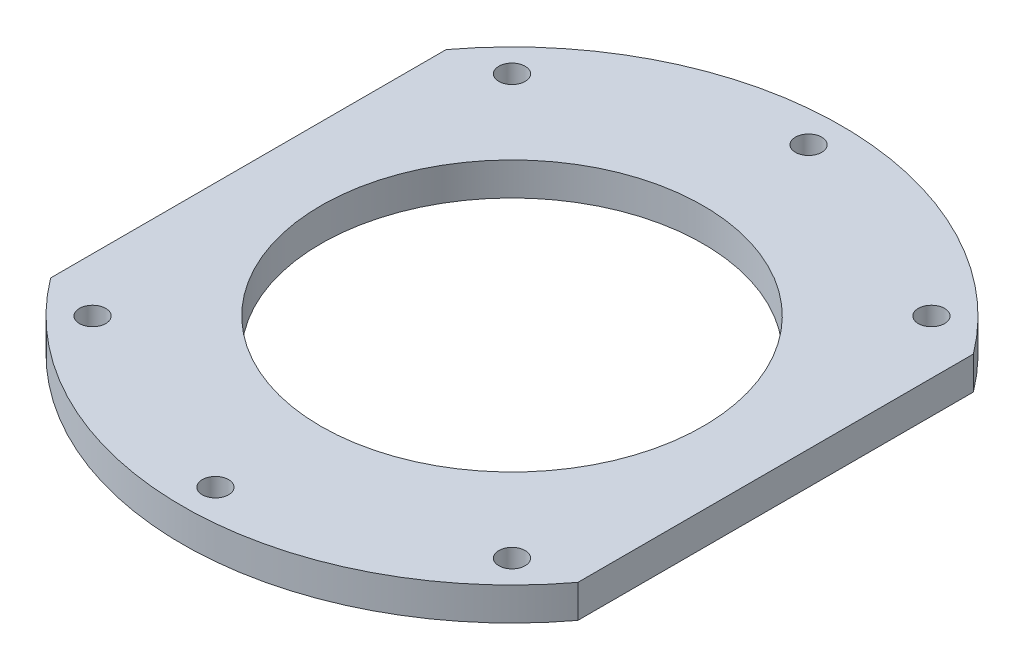
ISO-10303-21;
HEADER;
FILE_DESCRIPTION(('STEP AP214'),'2;1');
FILE_NAME('part.step','',(''),(''),'','','');
FILE_SCHEMA(('AUTOMOTIVE_DESIGN { 1 0 10303 214 1 1 1 1 }'));
ENDSEC;
DATA;
#1=APPLICATION_CONTEXT('core data for automotive mechanical design processes');
#2=APPLICATION_PROTOCOL_DEFINITION('international standard','automotive_design',2000,#1);
#3=PRODUCT_CONTEXT('',#1,'mechanical');
#4=PRODUCT('Part','Part','',(#3));
#5=PRODUCT_RELATED_PRODUCT_CATEGORY('part','',(#4));
#6=PRODUCT_DEFINITION_FORMATION('','',#4);
#7=PRODUCT_DEFINITION_CONTEXT('part definition',#1,'design');
#8=PRODUCT_DEFINITION('design','',#6,#7);
#9=PRODUCT_DEFINITION_SHAPE('','',#8);
#10=(LENGTH_UNIT() NAMED_UNIT(*) SI_UNIT(.MILLI.,.METRE.));
#11=(NAMED_UNIT(*) PLANE_ANGLE_UNIT() SI_UNIT($,.RADIAN.));
#12=(NAMED_UNIT(*) SI_UNIT($,.STERADIAN.) SOLID_ANGLE_UNIT());
#13=UNCERTAINTY_MEASURE_WITH_UNIT(LENGTH_MEASURE(1.E-05),#10,'distance_accuracy_value','');
#14=(GEOMETRIC_REPRESENTATION_CONTEXT(3) GLOBAL_UNCERTAINTY_ASSIGNED_CONTEXT((#13)) GLOBAL_UNIT_ASSIGNED_CONTEXT((#10,
#11,#12)) REPRESENTATION_CONTEXT('',''));
#15=CARTESIAN_POINT('',(0.,0.,0.));
#16=DIRECTION('',(0.,0.,1.));
#17=DIRECTION('',(1.,0.,0.));
#18=AXIS2_PLACEMENT_3D('',#15,#16,#17);
#19=CARTESIAN_POINT('',(0.,5.,0.));
#20=DIRECTION('',(0.,1.,0.));
#21=DIRECTION('',(0.,0.,1.));
#22=AXIS2_PLACEMENT_3D('',#19,#20,#21);
#23=PLANE('',#22);
#24=CARTESIAN_POINT('',(0.,5.,-45.));
#25=DIRECTION('',(0.,1.,0.));
#26=DIRECTION('',(0.,0.,1.));
#27=AXIS2_PLACEMENT_3D('',#24,#25,#26);
#28=CIRCLE('',#27,2.);
#29=CARTESIAN_POINT('',(0.,5.,-43.));
#30=VERTEX_POINT('',#29);
#31=EDGE_CURVE('E269',#30,#30,#28,.T.);
#32=ORIENTED_EDGE('',*,*,#31,.F.);
#33=EDGE_LOOP('',(#32));
#34=FACE_BOUND('',#33,.T.);
#35=CARTESIAN_POINT('',(0.,5.,45.));
#36=DIRECTION('',(0.,1.,0.));
#37=DIRECTION('',(0.,0.,1.));
#38=AXIS2_PLACEMENT_3D('',#35,#36,#37);
#39=CIRCLE('',#38,2.);
#40=CARTESIAN_POINT('',(0.,5.,47.));
#41=VERTEX_POINT('',#40);
#42=EDGE_CURVE('E287',#41,#41,#39,.T.);
#43=ORIENTED_EDGE('',*,*,#42,.F.);
#44=EDGE_LOOP('',(#43));
#45=FACE_BOUND('',#44,.T.);
#46=CARTESIAN_POINT('',(0.,5.,0.));
#47=DIRECTION('',(0.,1.,0.));
#48=DIRECTION('',(0.,0.,1.));
#49=AXIS2_PLACEMENT_3D('',#46,#47,#48);
#50=CIRCLE('',#49,29.);
#51=CARTESIAN_POINT('',(0.,5.,29.));
#52=VERTEX_POINT('',#51);
#53=EDGE_CURVE('E126',#52,#52,#50,.T.);
#54=ORIENTED_EDGE('',*,*,#53,.F.);
#55=EDGE_LOOP('',(#54));
#56=FACE_BOUND('',#55,.T.);
#57=CARTESIAN_POINT('',(31.8198051533946,5.,31.8198051533946));
#58=DIRECTION('',(0.,1.,0.));
#59=DIRECTION('',(0.,0.,1.));
#60=AXIS2_PLACEMENT_3D('',#57,#58,#59);
#61=CIRCLE('',#60,2.);
#62=CARTESIAN_POINT('',(31.8198051533946,5.,33.8198051533946));
#63=VERTEX_POINT('',#62);
#64=EDGE_CURVE('E293',#63,#63,#61,.T.);
#65=ORIENTED_EDGE('',*,*,#64,.F.);
#66=EDGE_LOOP('',(#65));
#67=FACE_BOUND('',#66,.T.);
#68=CARTESIAN_POINT('',(-31.8198051533946,5.,31.8198051533946));
#69=DIRECTION('',(0.,1.,0.));
#70=DIRECTION('',(0.,0.,1.));
#71=AXIS2_PLACEMENT_3D('',#68,#69,#70);
#72=CIRCLE('',#71,2.);
#73=CARTESIAN_POINT('',(-31.8198051533946,5.,33.8198051533946));
#74=VERTEX_POINT('',#73);
#75=EDGE_CURVE('E281',#74,#74,#72,.T.);
#76=ORIENTED_EDGE('',*,*,#75,.F.);
#77=EDGE_LOOP('',(#76));
#78=FACE_BOUND('',#77,.T.);
#79=CARTESIAN_POINT('',(-31.8198051533946,5.,-31.8198051533946));
#80=DIRECTION('',(0.,1.,0.));
#81=DIRECTION('',(0.,0.,1.));
#82=AXIS2_PLACEMENT_3D('',#79,#80,#81);
#83=CIRCLE('',#82,2.00000000000001);
#84=CARTESIAN_POINT('',(-31.8198051533946,5.,-29.8198051533946));
#85=VERTEX_POINT('',#84);
#86=EDGE_CURVE('E275',#85,#85,#83,.T.);
#87=ORIENTED_EDGE('',*,*,#86,.F.);
#88=EDGE_LOOP('',(#87));
#89=FACE_BOUND('',#88,.T.);
#90=CARTESIAN_POINT('',(31.8198051533946,5.,-31.8198051533947));
#91=DIRECTION('',(0.,1.,0.));
#92=DIRECTION('',(0.,0.,1.));
#93=AXIS2_PLACEMENT_3D('',#90,#91,#92);
#94=CIRCLE('',#93,2.00000000000001);
#95=CARTESIAN_POINT('',(31.8198051533946,5.,-29.8198051533946));
#96=VERTEX_POINT('',#95);
#97=EDGE_CURVE('E259',#96,#96,#94,.T.);
#98=ORIENTED_EDGE('',*,*,#97,.F.);
#99=EDGE_LOOP('',(#98));
#100=FACE_BOUND('',#99,.T.);
#101=CARTESIAN_POINT('',(0.,5.,0.));
#102=DIRECTION('',(0.,1.,0.));
#103=DIRECTION('',(0.,0.,1.));
#104=AXIS2_PLACEMENT_3D('',#101,#102,#103);
#105=CIRCLE('',#104,50.);
#106=CARTESIAN_POINT('',(-40.,5.,30.));
#107=VERTEX_POINT('',#106);
#108=CARTESIAN_POINT('',(40.,5.,30.));
#109=VERTEX_POINT('',#108);
#110=EDGE_CURVE('E112',#107,#109,#105,.T.);
#111=ORIENTED_EDGE('',*,*,#110,.T.);
#112=DIRECTION('',(0.,0.,-1.));
#113=VECTOR('',#112,1.);
#114=CARTESIAN_POINT('',(40.,5.,64.2430678170387));
#115=LINE('',#114,#113);
#116=CARTESIAN_POINT('',(40.,5.,-30.));
#117=VERTEX_POINT('',#116);
#118=EDGE_CURVE('E100',#109,#117,#115,.T.);
#119=ORIENTED_EDGE('',*,*,#118,.T.);
#120=CARTESIAN_POINT('',(-40.,5.,-30.));
#121=VERTEX_POINT('',#120);
#122=EDGE_CURVE('E116',#117,#121,#105,.T.);
#123=ORIENTED_EDGE('',*,*,#122,.T.);
#124=DIRECTION('',(0.,0.,1.));
#125=VECTOR('',#124,1.);
#126=CARTESIAN_POINT('',(-40.,5.,64.2430678170387));
#127=LINE('',#126,#125);
#128=EDGE_CURVE('E107',#121,#107,#127,.T.);
#129=ORIENTED_EDGE('',*,*,#128,.T.);
#130=EDGE_LOOP('',(#111,#119,#123,#129));
#131=FACE_BOUND('',#130,.T.);
#132=ADVANCED_FACE('F62',(#34,#45,#56,#67,#78,#89,#100,#131),#23,.T.);
#133=CARTESIAN_POINT('',(0.,0.,0.));
#134=DIRECTION('',(0.,1.,0.));
#135=DIRECTION('',(0.,0.,1.));
#136=AXIS2_PLACEMENT_3D('',#133,#134,#135);
#137=PLANE('',#136);
#138=CARTESIAN_POINT('',(0.,0.,0.));
#139=DIRECTION('',(0.,1.,0.));
#140=DIRECTION('',(0.,0.,1.));
#141=AXIS2_PLACEMENT_3D('',#138,#139,#140);
#142=CIRCLE('',#141,29.);
#143=CARTESIAN_POINT('',(0.,0.,29.));
#144=VERTEX_POINT('',#143);
#145=EDGE_CURVE('E123',#144,#144,#142,.T.);
#146=ORIENTED_EDGE('',*,*,#145,.T.);
#147=EDGE_LOOP('',(#146));
#148=FACE_BOUND('',#147,.T.);
#149=CARTESIAN_POINT('',(31.8198051533946,0.,31.8198051533946));
#150=DIRECTION('',(0.,1.,0.));
#151=DIRECTION('',(0.,0.,1.));
#152=AXIS2_PLACEMENT_3D('',#149,#150,#151);
#153=CIRCLE('',#152,2.);
#154=CARTESIAN_POINT('',(31.8198051533946,0.,33.8198051533946));
#155=VERTEX_POINT('',#154);
#156=EDGE_CURVE('E290',#155,#155,#153,.T.);
#157=ORIENTED_EDGE('',*,*,#156,.T.);
#158=EDGE_LOOP('',(#157));
#159=FACE_BOUND('',#158,.T.);
#160=CARTESIAN_POINT('',(0.,0.,45.));
#161=DIRECTION('',(0.,1.,0.));
#162=DIRECTION('',(0.,0.,1.));
#163=AXIS2_PLACEMENT_3D('',#160,#161,#162);
#164=CIRCLE('',#163,2.);
#165=CARTESIAN_POINT('',(0.,0.,47.));
#166=VERTEX_POINT('',#165);
#167=EDGE_CURVE('E284',#166,#166,#164,.T.);
#168=ORIENTED_EDGE('',*,*,#167,.T.);
#169=EDGE_LOOP('',(#168));
#170=FACE_BOUND('',#169,.T.);
#171=CARTESIAN_POINT('',(-31.8198051533946,0.,31.8198051533946));
#172=DIRECTION('',(0.,1.,0.));
#173=DIRECTION('',(0.,0.,1.));
#174=AXIS2_PLACEMENT_3D('',#171,#172,#173);
#175=CIRCLE('',#174,2.);
#176=CARTESIAN_POINT('',(-31.8198051533946,0.,33.8198051533946));
#177=VERTEX_POINT('',#176);
#178=EDGE_CURVE('E278',#177,#177,#175,.T.);
#179=ORIENTED_EDGE('',*,*,#178,.T.);
#180=EDGE_LOOP('',(#179));
#181=FACE_BOUND('',#180,.T.);
#182=CARTESIAN_POINT('',(-31.8198051533946,0.,-31.8198051533946));
#183=DIRECTION('',(0.,1.,0.));
#184=DIRECTION('',(0.,0.,1.));
#185=AXIS2_PLACEMENT_3D('',#182,#183,#184);
#186=CIRCLE('',#185,2.00000000000001);
#187=CARTESIAN_POINT('',(-31.8198051533946,0.,-29.8198051533946));
#188=VERTEX_POINT('',#187);
#189=EDGE_CURVE('E272',#188,#188,#186,.T.);
#190=ORIENTED_EDGE('',*,*,#189,.T.);
#191=EDGE_LOOP('',(#190));
#192=FACE_BOUND('',#191,.T.);
#193=CARTESIAN_POINT('',(0.,0.,-45.));
#194=DIRECTION('',(0.,1.,0.));
#195=DIRECTION('',(0.,0.,1.));
#196=AXIS2_PLACEMENT_3D('',#193,#194,#195);
#197=CIRCLE('',#196,2.);
#198=CARTESIAN_POINT('',(0.,0.,-43.));
#199=VERTEX_POINT('',#198);
#200=EDGE_CURVE('E265',#199,#199,#197,.T.);
#201=ORIENTED_EDGE('',*,*,#200,.T.);
#202=EDGE_LOOP('',(#201));
#203=FACE_BOUND('',#202,.T.);
#204=CARTESIAN_POINT('',(31.8198051533946,0.,-31.8198051533947));
#205=DIRECTION('',(0.,1.,0.));
#206=DIRECTION('',(0.,0.,1.));
#207=AXIS2_PLACEMENT_3D('',#204,#205,#206);
#208=CIRCLE('',#207,2.00000000000001);
#209=CARTESIAN_POINT('',(31.8198051533946,0.,-29.8198051533946));
#210=VERTEX_POINT('',#209);
#211=EDGE_CURVE('E262',#210,#210,#208,.T.);
#212=ORIENTED_EDGE('',*,*,#211,.T.);
#213=EDGE_LOOP('',(#212));
#214=FACE_BOUND('',#213,.T.);
#215=DIRECTION('',(0.,0.,-1.));
#216=VECTOR('',#215,1.);
#217=CARTESIAN_POINT('',(40.,0.,0.));
#218=LINE('',#217,#216);
#219=CARTESIAN_POINT('',(40.,0.,30.));
#220=VERTEX_POINT('',#219);
#221=CARTESIAN_POINT('',(40.,0.,-30.));
#222=VERTEX_POINT('',#221);
#223=EDGE_CURVE('E84',#220,#222,#218,.T.);
#224=ORIENTED_EDGE('',*,*,#223,.F.);
#225=CARTESIAN_POINT('',(0.,0.,0.));
#226=DIRECTION('',(0.,1.,0.));
#227=DIRECTION('',(0.,0.,1.));
#228=AXIS2_PLACEMENT_3D('',#225,#226,#227);
#229=CIRCLE('',#228,50.);
#230=CARTESIAN_POINT('',(-40.,0.,30.));
#231=VERTEX_POINT('',#230);
#232=EDGE_CURVE('E114',#231,#220,#229,.T.);
#233=ORIENTED_EDGE('',*,*,#232,.F.);
#234=DIRECTION('',(0.,0.,1.));
#235=VECTOR('',#234,1.);
#236=CARTESIAN_POINT('',(-40.,0.,0.));
#237=LINE('',#236,#235);
#238=CARTESIAN_POINT('',(-40.,0.,-30.));
#239=VERTEX_POINT('',#238);
#240=EDGE_CURVE('E77',#239,#231,#237,.T.);
#241=ORIENTED_EDGE('',*,*,#240,.F.);
#242=EDGE_CURVE('E117',#222,#239,#229,.T.);
#243=ORIENTED_EDGE('',*,*,#242,.F.);
#244=EDGE_LOOP('',(#224,#233,#241,#243));
#245=FACE_BOUND('',#244,.T.);
#246=ADVANCED_FACE('F134',(#148,#159,#170,#181,#192,#203,#214,#245),#137,.F.);
#247=CARTESIAN_POINT('',(0.,5.,0.));
#248=DIRECTION('',(0.,-1.,0.));
#249=DIRECTION('',(0.,0.,-1.));
#250=AXIS2_PLACEMENT_3D('',#247,#248,#249);
#251=CYLINDRICAL_SURFACE('',#250,50.);
#252=DIRECTION('',(0.,-1.,0.));
#253=VECTOR('',#252,1.);
#254=CARTESIAN_POINT('',(40.,5.,30.));
#255=LINE('',#254,#253);
#256=EDGE_CURVE('E12',#109,#220,#255,.T.);
#257=ORIENTED_EDGE('',*,*,#256,.F.);
#258=ORIENTED_EDGE('',*,*,#110,.F.);
#259=DIRECTION('',(0.,-1.,0.));
#260=VECTOR('',#259,1.);
#261=CARTESIAN_POINT('',(-40.,5.,30.));
#262=LINE('',#261,#260);
#263=EDGE_CURVE('E119',#231,#107,#262,.F.);
#264=ORIENTED_EDGE('',*,*,#263,.F.);
#265=ORIENTED_EDGE('',*,*,#232,.T.);
#266=EDGE_LOOP('',(#257,#258,#264,#265));
#267=FACE_BOUND('',#266,.T.);
#268=ADVANCED_FACE('F64',(#267),#251,.T.);
#269=DIRECTION('',(0.,-1.,0.));
#270=VECTOR('',#269,1.);
#271=CARTESIAN_POINT('',(40.,5.,-30.));
#272=LINE('',#271,#270);
#273=EDGE_CURVE('E70',#222,#117,#272,.F.);
#274=ORIENTED_EDGE('',*,*,#273,.F.);
#275=ORIENTED_EDGE('',*,*,#242,.T.);
#276=DIRECTION('',(0.,-1.,0.));
#277=VECTOR('',#276,1.);
#278=CARTESIAN_POINT('',(-40.,5.,-30.));
#279=LINE('',#278,#277);
#280=EDGE_CURVE('E128',#121,#239,#279,.T.);
#281=ORIENTED_EDGE('',*,*,#280,.F.);
#282=ORIENTED_EDGE('',*,*,#122,.F.);
#283=EDGE_LOOP('',(#274,#275,#281,#282));
#284=FACE_BOUND('',#283,.T.);
#285=ADVANCED_FACE('F136',(#284),#251,.T.);
#286=CARTESIAN_POINT('',(0.,5.,0.));
#287=DIRECTION('',(0.,-1.,0.));
#288=DIRECTION('',(0.,0.,-1.));
#289=AXIS2_PLACEMENT_3D('',#286,#287,#288);
#290=CYLINDRICAL_SURFACE('',#289,29.);
#291=ORIENTED_EDGE('',*,*,#53,.T.);
#292=EDGE_LOOP('',(#291));
#293=FACE_BOUND('',#292,.T.);
#294=ORIENTED_EDGE('',*,*,#145,.F.);
#295=EDGE_LOOP('',(#294));
#296=FACE_BOUND('',#295,.T.);
#297=ADVANCED_FACE('F138',(#293,#296),#290,.F.);
#298=CARTESIAN_POINT('',(31.8198051533946,5.,31.8198051533946));
#299=DIRECTION('',(0.,-1.,0.));
#300=DIRECTION('',(0.,0.,-1.));
#301=AXIS2_PLACEMENT_3D('',#298,#299,#300);
#302=CYLINDRICAL_SURFACE('',#301,2.);
#303=ORIENTED_EDGE('',*,*,#64,.T.);
#304=EDGE_LOOP('',(#303));
#305=FACE_BOUND('',#304,.T.);
#306=ORIENTED_EDGE('',*,*,#156,.F.);
#307=EDGE_LOOP('',(#306));
#308=FACE_BOUND('',#307,.T.);
#309=ADVANCED_FACE('F143',(#305,#308),#302,.F.);
#310=CARTESIAN_POINT('',(0.,5.,45.));
#311=DIRECTION('',(0.,-1.,0.));
#312=DIRECTION('',(0.,0.,-1.));
#313=AXIS2_PLACEMENT_3D('',#310,#311,#312);
#314=CYLINDRICAL_SURFACE('',#313,2.);
#315=ORIENTED_EDGE('',*,*,#42,.T.);
#316=EDGE_LOOP('',(#315));
#317=FACE_BOUND('',#316,.T.);
#318=ORIENTED_EDGE('',*,*,#167,.F.);
#319=EDGE_LOOP('',(#318));
#320=FACE_BOUND('',#319,.T.);
#321=ADVANCED_FACE('F158',(#317,#320),#314,.F.);
#322=CARTESIAN_POINT('',(-31.8198051533946,5.,31.8198051533946));
#323=DIRECTION('',(0.,-1.,0.));
#324=DIRECTION('',(0.,0.,-1.));
#325=AXIS2_PLACEMENT_3D('',#322,#323,#324);
#326=CYLINDRICAL_SURFACE('',#325,2.);
#327=ORIENTED_EDGE('',*,*,#75,.T.);
#328=EDGE_LOOP('',(#327));
#329=FACE_BOUND('',#328,.T.);
#330=ORIENTED_EDGE('',*,*,#178,.F.);
#331=EDGE_LOOP('',(#330));
#332=FACE_BOUND('',#331,.T.);
#333=ADVANCED_FACE('F162',(#329,#332),#326,.F.);
#334=CARTESIAN_POINT('',(-31.8198051533946,5.,-31.8198051533946));
#335=DIRECTION('',(0.,-1.,0.));
#336=DIRECTION('',(0.,0.,-1.));
#337=AXIS2_PLACEMENT_3D('',#334,#335,#336);
#338=CYLINDRICAL_SURFACE('',#337,2.00000000000001);
#339=ORIENTED_EDGE('',*,*,#86,.T.);
#340=EDGE_LOOP('',(#339));
#341=FACE_BOUND('',#340,.T.);
#342=ORIENTED_EDGE('',*,*,#189,.F.);
#343=EDGE_LOOP('',(#342));
#344=FACE_BOUND('',#343,.T.);
#345=ADVANCED_FACE('F166',(#341,#344),#338,.F.);
#346=CARTESIAN_POINT('',(0.,5.,-45.));
#347=DIRECTION('',(0.,-1.,0.));
#348=DIRECTION('',(0.,0.,-1.));
#349=AXIS2_PLACEMENT_3D('',#346,#347,#348);
#350=CYLINDRICAL_SURFACE('',#349,2.);
#351=ORIENTED_EDGE('',*,*,#31,.T.);
#352=EDGE_LOOP('',(#351));
#353=FACE_BOUND('',#352,.T.);
#354=ORIENTED_EDGE('',*,*,#200,.F.);
#355=EDGE_LOOP('',(#354));
#356=FACE_BOUND('',#355,.T.);
#357=ADVANCED_FACE('F170',(#353,#356),#350,.F.);
#358=CARTESIAN_POINT('',(31.8198051533946,5.,-31.8198051533947));
#359=DIRECTION('',(0.,-1.,0.));
#360=DIRECTION('',(0.,0.,-1.));
#361=AXIS2_PLACEMENT_3D('',#358,#359,#360);
#362=CYLINDRICAL_SURFACE('',#361,2.00000000000001);
#363=ORIENTED_EDGE('',*,*,#97,.T.);
#364=EDGE_LOOP('',(#363));
#365=FACE_BOUND('',#364,.T.);
#366=ORIENTED_EDGE('',*,*,#211,.F.);
#367=EDGE_LOOP('',(#366));
#368=FACE_BOUND('',#367,.T.);
#369=ADVANCED_FACE('F174',(#365,#368),#362,.F.);
#370=CARTESIAN_POINT('',(-40.,-5.,64.2430678170387));
#371=DIRECTION('',(-1.,0.,0.));
#372=DIRECTION('',(0.,0.,1.));
#373=AXIS2_PLACEMENT_3D('',#370,#371,#372);
#374=PLANE('',#373);
#375=ORIENTED_EDGE('',*,*,#280,.T.);
#376=ORIENTED_EDGE('',*,*,#240,.T.);
#377=ORIENTED_EDGE('',*,*,#263,.T.);
#378=ORIENTED_EDGE('',*,*,#128,.F.);
#379=EDGE_LOOP('',(#375,#376,#377,#378));
#380=FACE_BOUND('',#379,.T.);
#381=ADVANCED_FACE('F130',(#380),#374,.T.);
#382=CARTESIAN_POINT('',(40.,-5.,64.2430678170387));
#383=DIRECTION('',(1.,0.,0.));
#384=DIRECTION('',(0.,0.,-1.));
#385=AXIS2_PLACEMENT_3D('',#382,#383,#384);
#386=PLANE('',#385);
#387=ORIENTED_EDGE('',*,*,#256,.T.);
#388=ORIENTED_EDGE('',*,*,#223,.T.);
#389=ORIENTED_EDGE('',*,*,#273,.T.);
#390=ORIENTED_EDGE('',*,*,#118,.F.);
#391=EDGE_LOOP('',(#387,#388,#389,#390));
#392=FACE_BOUND('',#391,.T.);
#393=ADVANCED_FACE('F102',(#392),#386,.T.);
#394=CLOSED_SHELL('',(#132,#246,#268,#285,#297,#309,#321,#333,#345,#357,#369,#381,#393));
#395=MANIFOLD_SOLID_BREP('B2',#394);
#396=ADVANCED_BREP_SHAPE_REPRESENTATION('',(#18,#395),#14);
#397=SHAPE_DEFINITION_REPRESENTATION(#9,#396);
ENDSEC;
END-ISO-10303-21;
